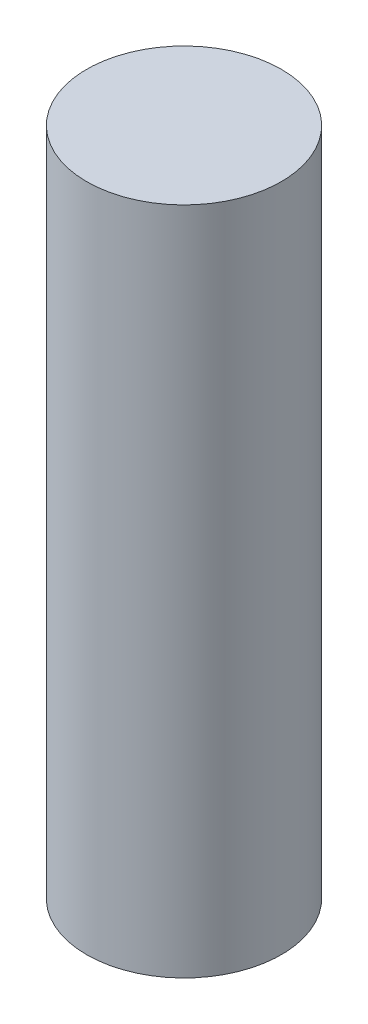
ISO-10303-21;
HEADER;
FILE_DESCRIPTION(('STEP AP214'),'2;1');
FILE_NAME('part.step','',(''),(''),'','','');
FILE_SCHEMA(('AUTOMOTIVE_DESIGN { 1 0 10303 214 1 1 1 1 }'));
ENDSEC;
DATA;
#1=APPLICATION_CONTEXT('core data for automotive mechanical design processes');
#2=APPLICATION_PROTOCOL_DEFINITION('international standard','automotive_design',2000,#1);
#3=PRODUCT_CONTEXT('',#1,'mechanical');
#4=PRODUCT('Part','Part','',(#3));
#5=PRODUCT_RELATED_PRODUCT_CATEGORY('part','',(#4));
#6=PRODUCT_DEFINITION_FORMATION('','',#4);
#7=PRODUCT_DEFINITION_CONTEXT('part definition',#1,'design');
#8=PRODUCT_DEFINITION('design','',#6,#7);
#9=PRODUCT_DEFINITION_SHAPE('','',#8);
#10=(LENGTH_UNIT() NAMED_UNIT(*) SI_UNIT(.MILLI.,.METRE.));
#11=(NAMED_UNIT(*) PLANE_ANGLE_UNIT() SI_UNIT($,.RADIAN.));
#12=(NAMED_UNIT(*) SI_UNIT($,.STERADIAN.) SOLID_ANGLE_UNIT());
#13=UNCERTAINTY_MEASURE_WITH_UNIT(LENGTH_MEASURE(1.E-05),#10,'distance_accuracy_value','');
#14=(GEOMETRIC_REPRESENTATION_CONTEXT(3) GLOBAL_UNCERTAINTY_ASSIGNED_CONTEXT((#13)) GLOBAL_UNIT_ASSIGNED_CONTEXT((#10,
#11,#12)) REPRESENTATION_CONTEXT('',''));
#15=CARTESIAN_POINT('',(0.,0.,0.));
#16=DIRECTION('',(0.,0.,1.));
#17=DIRECTION('',(1.,0.,0.));
#18=AXIS2_PLACEMENT_3D('',#15,#16,#17);
#19=CARTESIAN_POINT('',(0.,20.701,0.));
#20=DIRECTION('',(0.,-1.,0.));
#21=DIRECTION('',(0.,0.,-1.));
#22=AXIS2_PLACEMENT_3D('',#19,#20,#21);
#23=CYLINDRICAL_SURFACE('',#22,6.0198);
#24=CARTESIAN_POINT('',(0.,20.701,0.));
#25=DIRECTION('',(0.,1.,0.));
#26=DIRECTION('',(0.,0.,1.));
#27=AXIS2_PLACEMENT_3D('',#24,#25,#26);
#28=CIRCLE('',#27,6.0198);
#29=CARTESIAN_POINT('',(0.,20.701,6.0198));
#30=VERTEX_POINT('',#29);
#31=EDGE_CURVE('E10',#30,#30,#28,.T.);
#32=ORIENTED_EDGE('',*,*,#31,.F.);
#33=EDGE_LOOP('',(#32));
#34=FACE_BOUND('',#33,.T.);
#35=CARTESIAN_POINT('',(0.,-20.701,0.));
#36=DIRECTION('',(0.,1.,0.));
#37=DIRECTION('',(0.,0.,1.));
#38=AXIS2_PLACEMENT_3D('',#35,#36,#37);
#39=CIRCLE('',#38,6.0198);
#40=CARTESIAN_POINT('',(0.,-20.701,6.0198));
#41=VERTEX_POINT('',#40);
#42=EDGE_CURVE('E35',#41,#41,#39,.T.);
#43=ORIENTED_EDGE('',*,*,#42,.T.);
#44=EDGE_LOOP('',(#43));
#45=FACE_BOUND('',#44,.T.);
#46=ADVANCED_FACE('F32',(#34,#45),#23,.T.);
#47=CARTESIAN_POINT('',(0.,20.701,0.));
#48=DIRECTION('',(0.,1.,0.));
#49=DIRECTION('',(0.,0.,1.));
#50=AXIS2_PLACEMENT_3D('',#47,#48,#49);
#51=PLANE('',#50);
#52=ORIENTED_EDGE('',*,*,#31,.T.);
#53=EDGE_LOOP('',(#52));
#54=FACE_BOUND('',#53,.T.);
#55=ADVANCED_FACE('F47',(#54),#51,.T.);
#56=CARTESIAN_POINT('',(0.,-20.701,0.));
#57=DIRECTION('',(0.,1.,0.));
#58=DIRECTION('',(0.,0.,1.));
#59=AXIS2_PLACEMENT_3D('',#56,#57,#58);
#60=PLANE('',#59);
#61=ORIENTED_EDGE('',*,*,#42,.F.);
#62=EDGE_LOOP('',(#61));
#63=FACE_BOUND('',#62,.T.);
#64=ADVANCED_FACE('F45',(#63),#60,.F.);
#65=CLOSED_SHELL('',(#46,#55,#64));
#66=MANIFOLD_SOLID_BREP('B2',#65);
#67=ADVANCED_BREP_SHAPE_REPRESENTATION('',(#18,#66),#14);
#68=SHAPE_DEFINITION_REPRESENTATION(#9,#67);
ENDSEC;
END-ISO-10303-21;
